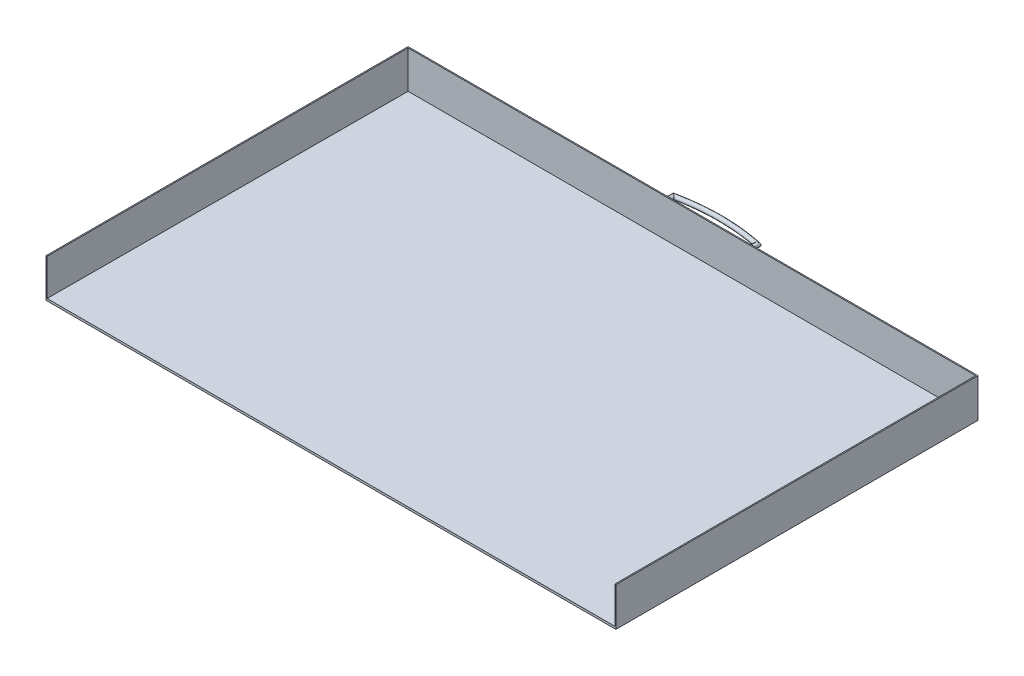
ISO-10303-21;
HEADER;
FILE_DESCRIPTION(('STEP AP214'),'2;1');
FILE_NAME('part.step','',(''),(''),'','','');
FILE_SCHEMA(('AUTOMOTIVE_DESIGN { 1 0 10303 214 1 1 1 1 }'));
ENDSEC;
DATA;
#1=APPLICATION_CONTEXT('core data for automotive mechanical design processes');
#2=APPLICATION_PROTOCOL_DEFINITION('international standard','automotive_design',2000,#1);
#3=PRODUCT_CONTEXT('',#1,'mechanical');
#4=PRODUCT('Part','Part','',(#3));
#5=PRODUCT_RELATED_PRODUCT_CATEGORY('part','',(#4));
#6=PRODUCT_DEFINITION_FORMATION('','',#4);
#7=PRODUCT_DEFINITION_CONTEXT('part definition',#1,'design');
#8=PRODUCT_DEFINITION('design','',#6,#7);
#9=PRODUCT_DEFINITION_SHAPE('','',#8);
#10=(LENGTH_UNIT() NAMED_UNIT(*) SI_UNIT(.MILLI.,.METRE.));
#11=(NAMED_UNIT(*) PLANE_ANGLE_UNIT() SI_UNIT($,.RADIAN.));
#12=(NAMED_UNIT(*) SI_UNIT($,.STERADIAN.) SOLID_ANGLE_UNIT());
#13=UNCERTAINTY_MEASURE_WITH_UNIT(LENGTH_MEASURE(1.E-05),#10,'distance_accuracy_value','');
#14=(GEOMETRIC_REPRESENTATION_CONTEXT(3) GLOBAL_UNCERTAINTY_ASSIGNED_CONTEXT((#13)) GLOBAL_UNIT_ASSIGNED_CONTEXT((#10,
#11,#12)) REPRESENTATION_CONTEXT('',''));
#15=CARTESIAN_POINT('',(0.,0.,0.));
#16=DIRECTION('',(0.,0.,1.));
#17=DIRECTION('',(1.,0.,0.));
#18=AXIS2_PLACEMENT_3D('',#15,#16,#17);
#19=CARTESIAN_POINT('',(0.,0.,0.));
#20=DIRECTION('',(0.,0.,1.));
#21=DIRECTION('',(1.,0.,0.));
#22=AXIS2_PLACEMENT_3D('',#19,#20,#21);
#23=PLANE('',#22);
#24=CARTESIAN_POINT('',(75.,0.,0.));
#25=DIRECTION('',(0.,0.,-1.));
#26=DIRECTION('',(-1.,0.,0.));
#27=AXIS2_PLACEMENT_3D('',#24,#25,#26);
#28=CIRCLE('',#27,4.00000000000001);
#29=CARTESIAN_POINT('',(71.,0.,0.));
#30=VERTEX_POINT('',#29);
#31=EDGE_CURVE('E11',#30,#30,#28,.T.);
#32=ORIENTED_EDGE('',*,*,#31,.F.);
#33=EDGE_LOOP('',(#32));
#34=FACE_BOUND('',#33,.T.);
#35=DIRECTION('',(0.,1.,0.));
#36=VECTOR('',#35,1.);
#37=CARTESIAN_POINT('',(511.5,34.75,0.));
#38=LINE('',#37,#36);
#39=CARTESIAN_POINT('',(511.5,-34.75,0.));
#40=VERTEX_POINT('',#39);
#41=CARTESIAN_POINT('',(511.5,34.75,0.));
#42=VERTEX_POINT('',#41);
#43=EDGE_CURVE('E200',#40,#42,#38,.T.);
#44=ORIENTED_EDGE('',*,*,#43,.F.);
#45=DIRECTION('',(1.,0.,0.));
#46=VECTOR('',#45,1.);
#47=CARTESIAN_POINT('',(-511.5,-34.75,0.));
#48=LINE('',#47,#46);
#49=CARTESIAN_POINT('',(-511.5,-34.75,0.));
#50=VERTEX_POINT('',#49);
#51=EDGE_CURVE('E79',#50,#40,#48,.T.);
#52=ORIENTED_EDGE('',*,*,#51,.F.);
#53=DIRECTION('',(0.,-1.,0.));
#54=VECTOR('',#53,1.);
#55=CARTESIAN_POINT('',(-511.5,34.75,0.));
#56=LINE('',#55,#54);
#57=CARTESIAN_POINT('',(-511.5,34.75,0.));
#58=VERTEX_POINT('',#57);
#59=EDGE_CURVE('E73',#58,#50,#56,.T.);
#60=ORIENTED_EDGE('',*,*,#59,.F.);
#61=DIRECTION('',(-1.,0.,0.));
#62=VECTOR('',#61,1.);
#63=CARTESIAN_POINT('',(-511.5,34.75,0.));
#64=LINE('',#63,#62);
#65=EDGE_CURVE('E255',#42,#58,#64,.T.);
#66=ORIENTED_EDGE('',*,*,#65,.F.);
#67=EDGE_LOOP('',(#44,#52,#60,#66));
#68=FACE_BOUND('',#67,.T.);
#69=CARTESIAN_POINT('',(-75.,0.,0.));
#70=DIRECTION('',(0.,0.,1.));
#71=DIRECTION('',(1.,0.,0.));
#72=AXIS2_PLACEMENT_3D('',#69,#70,#71);
#73=CIRCLE('',#72,4.00000000000001);
#74=CARTESIAN_POINT('',(-71.,0.,0.));
#75=VERTEX_POINT('',#74);
#76=EDGE_CURVE('E132',#75,#75,#73,.T.);
#77=ORIENTED_EDGE('',*,*,#76,.T.);
#78=EDGE_LOOP('',(#77));
#79=FACE_BOUND('',#78,.T.);
#80=ADVANCED_FACE('F37',(#34,#68,#79),#23,.F.);
#81=CARTESIAN_POINT('',(509.5,34.75,650.));
#82=DIRECTION('',(-1.,0.,0.));
#83=DIRECTION('',(0.,-1.,0.));
#84=AXIS2_PLACEMENT_3D('',#81,#82,#83);
#85=PLANE('',#84);
#86=DIRECTION('',(0.,1.,0.));
#87=VECTOR('',#86,1.);
#88=CARTESIAN_POINT('',(509.5,34.75,2.));
#89=LINE('',#88,#87);
#90=CARTESIAN_POINT('',(509.5,-32.75,2.));
#91=VERTEX_POINT('',#90);
#92=CARTESIAN_POINT('',(509.5,34.75,2.));
#93=VERTEX_POINT('',#92);
#94=EDGE_CURVE('E279',#91,#93,#89,.T.);
#95=ORIENTED_EDGE('',*,*,#94,.F.);
#96=DIRECTION('',(0.,-0.00296314550510196,-0.999995609874721));
#97=VECTOR('',#96,1.);
#98=CARTESIAN_POINT('',(509.5,-30.8298732830971,650.));
#99=LINE('',#98,#97);
#100=CARTESIAN_POINT('',(509.5,-30.8298732830971,650.));
#101=VERTEX_POINT('',#100);
#102=EDGE_CURVE('E135',#101,#91,#99,.T.);
#103=ORIENTED_EDGE('',*,*,#102,.F.);
#104=DIRECTION('',(0.,1.,0.));
#105=VECTOR('',#104,1.);
#106=CARTESIAN_POINT('',(509.5,34.75,650.));
#107=LINE('',#106,#105);
#108=CARTESIAN_POINT('',(509.5,34.75,650.));
#109=VERTEX_POINT('',#108);
#110=EDGE_CURVE('E265',#101,#109,#107,.T.);
#111=ORIENTED_EDGE('',*,*,#110,.T.);
#112=DIRECTION('',(0.,0.,-1.));
#113=VECTOR('',#112,1.);
#114=CARTESIAN_POINT('',(509.5,34.75,650.));
#115=LINE('',#114,#113);
#116=EDGE_CURVE('E256',#109,#93,#115,.T.);
#117=ORIENTED_EDGE('',*,*,#116,.T.);
#118=EDGE_LOOP('',(#95,#103,#111,#117));
#119=FACE_BOUND('',#118,.T.);
#120=ADVANCED_FACE('F195',(#119),#85,.T.);
#121=CARTESIAN_POINT('',(-509.5,34.75,650.));
#122=DIRECTION('',(1.,0.,0.));
#123=DIRECTION('',(0.,1.,0.));
#124=AXIS2_PLACEMENT_3D('',#121,#122,#123);
#125=PLANE('',#124);
#126=DIRECTION('',(0.,-1.,0.));
#127=VECTOR('',#126,1.);
#128=CARTESIAN_POINT('',(-509.5,34.75,650.));
#129=LINE('',#128,#127);
#130=CARTESIAN_POINT('',(-509.5,34.75,650.));
#131=VERTEX_POINT('',#130);
#132=CARTESIAN_POINT('',(-509.5,-30.8298732830987,650.));
#133=VERTEX_POINT('',#132);
#134=EDGE_CURVE('E268',#131,#133,#129,.T.);
#135=ORIENTED_EDGE('',*,*,#134,.T.);
#136=DIRECTION('',(0.,0.00296314550510196,0.999995609874721));
#137=VECTOR('',#136,1.);
#138=CARTESIAN_POINT('',(-509.5,-30.8298732830987,650.));
#139=LINE('',#138,#137);
#140=CARTESIAN_POINT('',(-509.5,-32.7500000000016,1.99999999999989));
#141=VERTEX_POINT('',#140);
#142=EDGE_CURVE('E285',#141,#133,#139,.T.);
#143=ORIENTED_EDGE('',*,*,#142,.F.);
#144=DIRECTION('',(0.,-1.,0.));
#145=VECTOR('',#144,1.);
#146=CARTESIAN_POINT('',(-509.5,34.75,2.));
#147=LINE('',#146,#145);
#148=CARTESIAN_POINT('',(-509.5,34.75,2.));
#149=VERTEX_POINT('',#148);
#150=EDGE_CURVE('E273',#149,#141,#147,.T.);
#151=ORIENTED_EDGE('',*,*,#150,.F.);
#152=DIRECTION('',(0.,0.,-1.));
#153=VECTOR('',#152,1.);
#154=CARTESIAN_POINT('',(-509.5,34.75,650.));
#155=LINE('',#154,#153);
#156=EDGE_CURVE('E241',#131,#149,#155,.T.);
#157=ORIENTED_EDGE('',*,*,#156,.F.);
#158=EDGE_LOOP('',(#135,#143,#151,#157));
#159=FACE_BOUND('',#158,.T.);
#160=ADVANCED_FACE('F218',(#159),#125,.T.);
#161=CARTESIAN_POINT('',(511.5,34.75,650.));
#162=DIRECTION('',(-1.,0.,0.));
#163=DIRECTION('',(0.,-1.,0.));
#164=AXIS2_PLACEMENT_3D('',#161,#162,#163);
#165=PLANE('',#164);
#166=ORIENTED_EDGE('',*,*,#43,.T.);
#167=DIRECTION('',(0.,0.,-1.));
#168=VECTOR('',#167,1.);
#169=CARTESIAN_POINT('',(511.5,34.75,650.));
#170=LINE('',#169,#168);
#171=CARTESIAN_POINT('',(511.5,34.75,650.));
#172=VERTEX_POINT('',#171);
#173=EDGE_CURVE('E41',#172,#42,#170,.T.);
#174=ORIENTED_EDGE('',*,*,#173,.F.);
#175=DIRECTION('',(0.,1.,0.));
#176=VECTOR('',#175,1.);
#177=CARTESIAN_POINT('',(511.5,34.75,650.));
#178=LINE('',#177,#176);
#179=CARTESIAN_POINT('',(511.5,-34.75,650.));
#180=VERTEX_POINT('',#179);
#181=EDGE_CURVE('E245',#180,#172,#178,.T.);
#182=ORIENTED_EDGE('',*,*,#181,.F.);
#183=DIRECTION('',(0.,0.,-1.));
#184=VECTOR('',#183,1.);
#185=CARTESIAN_POINT('',(511.5,-34.75,650.));
#186=LINE('',#185,#184);
#187=EDGE_CURVE('E253',#180,#40,#186,.T.);
#188=ORIENTED_EDGE('',*,*,#187,.T.);
#189=EDGE_LOOP('',(#166,#174,#182,#188));
#190=FACE_BOUND('',#189,.T.);
#191=ADVANCED_FACE('F39',(#190),#165,.F.);
#192=CARTESIAN_POINT('',(-511.5,34.75,650.));
#193=DIRECTION('',(0.,-1.,0.));
#194=DIRECTION('',(0.,0.,-1.));
#195=AXIS2_PLACEMENT_3D('',#192,#193,#194);
#196=PLANE('',#195);
#197=DIRECTION('',(-1.,0.,0.));
#198=VECTOR('',#197,1.);
#199=CARTESIAN_POINT('',(-511.5,34.75,650.));
#200=LINE('',#199,#198);
#201=CARTESIAN_POINT('',(-511.5,34.75,650.));
#202=VERTEX_POINT('',#201);
#203=EDGE_CURVE('E239',#131,#202,#200,.T.);
#204=ORIENTED_EDGE('',*,*,#203,.F.);
#205=ORIENTED_EDGE('',*,*,#156,.T.);
#206=DIRECTION('',(-1.,0.,0.));
#207=VECTOR('',#206,1.);
#208=CARTESIAN_POINT('',(-511.5,34.75,2.));
#209=LINE('',#208,#207);
#210=EDGE_CURVE('E277',#93,#149,#209,.T.);
#211=ORIENTED_EDGE('',*,*,#210,.F.);
#212=ORIENTED_EDGE('',*,*,#116,.F.);
#213=EDGE_CURVE('E87',#172,#109,#200,.T.);
#214=ORIENTED_EDGE('',*,*,#213,.F.);
#215=ORIENTED_EDGE('',*,*,#173,.T.);
#216=ORIENTED_EDGE('',*,*,#65,.T.);
#217=DIRECTION('',(0.,0.,-1.));
#218=VECTOR('',#217,1.);
#219=CARTESIAN_POINT('',(-511.5,34.75,650.));
#220=LINE('',#219,#218);
#221=EDGE_CURVE('E242',#202,#58,#220,.T.);
#222=ORIENTED_EDGE('',*,*,#221,.F.);
#223=EDGE_LOOP('',(#204,#205,#211,#212,#214,#215,#216,#222));
#224=FACE_BOUND('',#223,.T.);
#225=ADVANCED_FACE('F230',(#224),#196,.F.);
#226=CARTESIAN_POINT('',(-511.5,34.75,650.));
#227=DIRECTION('',(1.,0.,0.));
#228=DIRECTION('',(0.,1.,0.));
#229=AXIS2_PLACEMENT_3D('',#226,#227,#228);
#230=PLANE('',#229);
#231=ORIENTED_EDGE('',*,*,#59,.T.);
#232=DIRECTION('',(0.,0.,-1.));
#233=VECTOR('',#232,1.);
#234=CARTESIAN_POINT('',(-511.5,-34.75,650.));
#235=LINE('',#234,#233);
#236=CARTESIAN_POINT('',(-511.5,-34.75,650.));
#237=VERTEX_POINT('',#236);
#238=EDGE_CURVE('E261',#237,#50,#235,.T.);
#239=ORIENTED_EDGE('',*,*,#238,.F.);
#240=DIRECTION('',(0.,-1.,0.));
#241=VECTOR('',#240,1.);
#242=CARTESIAN_POINT('',(-511.5,34.75,650.));
#243=LINE('',#242,#241);
#244=EDGE_CURVE('E247',#202,#237,#243,.T.);
#245=ORIENTED_EDGE('',*,*,#244,.F.);
#246=ORIENTED_EDGE('',*,*,#221,.T.);
#247=EDGE_LOOP('',(#231,#239,#245,#246));
#248=FACE_BOUND('',#247,.T.);
#249=ADVANCED_FACE('F228',(#248),#230,.F.);
#250=CARTESIAN_POINT('',(-511.5,-34.75,650.));
#251=DIRECTION('',(0.,1.,0.));
#252=DIRECTION('',(0.,0.,1.));
#253=AXIS2_PLACEMENT_3D('',#250,#251,#252);
#254=PLANE('',#253);
#255=ORIENTED_EDGE('',*,*,#51,.T.);
#256=ORIENTED_EDGE('',*,*,#187,.F.);
#257=DIRECTION('',(1.,0.,0.));
#258=VECTOR('',#257,1.);
#259=CARTESIAN_POINT('',(-511.5,-34.75,650.));
#260=LINE('',#259,#258);
#261=EDGE_CURVE('E55',#237,#180,#260,.T.);
#262=ORIENTED_EDGE('',*,*,#261,.F.);
#263=ORIENTED_EDGE('',*,*,#238,.T.);
#264=EDGE_LOOP('',(#255,#256,#262,#263));
#265=FACE_BOUND('',#264,.T.);
#266=ADVANCED_FACE('F224',(#265),#254,.F.);
#267=CARTESIAN_POINT('',(0.,0.,650.));
#268=DIRECTION('',(0.,0.,1.));
#269=DIRECTION('',(1.,0.,0.));
#270=AXIS2_PLACEMENT_3D('',#267,#268,#269);
#271=PLANE('',#270);
#272=ORIENTED_EDGE('',*,*,#110,.F.);
#273=DIRECTION('',(1.,0.,0.));
#274=VECTOR('',#273,1.);
#275=CARTESIAN_POINT('',(-1157.50284481367,-30.8298732830997,650.));
#276=LINE('',#275,#274);
#277=EDGE_CURVE('E137',#133,#101,#276,.T.);
#278=ORIENTED_EDGE('',*,*,#277,.F.);
#279=ORIENTED_EDGE('',*,*,#134,.F.);
#280=ORIENTED_EDGE('',*,*,#203,.T.);
#281=ORIENTED_EDGE('',*,*,#244,.T.);
#282=ORIENTED_EDGE('',*,*,#261,.T.);
#283=ORIENTED_EDGE('',*,*,#181,.T.);
#284=ORIENTED_EDGE('',*,*,#213,.T.);
#285=EDGE_LOOP('',(#272,#278,#279,#280,#281,#282,#283,#284));
#286=FACE_BOUND('',#285,.T.);
#287=ADVANCED_FACE('F212',(#286),#271,.T.);
#288=CARTESIAN_POINT('',(0.,0.,2.));
#289=DIRECTION('',(0.,0.,1.));
#290=DIRECTION('',(1.,0.,0.));
#291=AXIS2_PLACEMENT_3D('',#288,#289,#290);
#292=PLANE('',#291);
#293=ORIENTED_EDGE('',*,*,#94,.T.);
#294=ORIENTED_EDGE('',*,*,#210,.T.);
#295=ORIENTED_EDGE('',*,*,#150,.T.);
#296=DIRECTION('',(1.,0.,0.));
#297=VECTOR('',#296,1.);
#298=CARTESIAN_POINT('',(-511.5,-32.75,2.));
#299=LINE('',#298,#297);
#300=EDGE_CURVE('E269',#141,#91,#299,.T.);
#301=ORIENTED_EDGE('',*,*,#300,.T.);
#302=EDGE_LOOP('',(#293,#294,#295,#301));
#303=FACE_BOUND('',#302,.T.);
#304=ADVANCED_FACE('F206',(#303),#292,.T.);
#305=CARTESIAN_POINT('',(-1157.50284481367,-30.8298732830997,650.));
#306=DIRECTION('',(0.,-0.999995609874721,0.00296314550510196));
#307=DIRECTION('',(0.,-0.00296314550510196,-0.999995609874721));
#308=AXIS2_PLACEMENT_3D('',#305,#306,#307);
#309=PLANE('',#308);
#310=ORIENTED_EDGE('',*,*,#300,.F.);
#311=ORIENTED_EDGE('',*,*,#142,.T.);
#312=ORIENTED_EDGE('',*,*,#277,.T.);
#313=ORIENTED_EDGE('',*,*,#102,.T.);
#314=EDGE_LOOP('',(#310,#311,#312,#313));
#315=FACE_BOUND('',#314,.T.);
#316=ADVANCED_FACE('F190',(#315),#309,.F.);
#317=CARTESIAN_POINT('',(75.,0.,-43.6672146269681));
#318=DIRECTION('',(0.,0.,1.));
#319=DIRECTION('',(1.,0.,0.));
#320=AXIS2_PLACEMENT_3D('',#317,#318,#319);
#321=CYLINDRICAL_SURFACE('',#320,4.00000000000001);
#322=CARTESIAN_POINT('',(75.,4.00000000000001,-40.));
#323=CARTESIAN_POINT('',(74.9966888627079,3.9999999966633,-39.9973155580531));
#324=CARTESIAN_POINT('',(74.9933776760839,3.99999588538589,-39.9946310453858));
#325=CARTESIAN_POINT('',(74.7272778646039,3.99933531565997,-39.7788907181345));
#326=CARTESIAN_POINT('',(74.4642231566213,3.97280534390981,-39.5654257995756));
#327=CARTESIAN_POINT('',(73.9444377564612,3.86732475750649,-39.1432534765215));
#328=CARTESIAN_POINT('',(73.6877126405359,3.78832952108415,-38.9345502782947));
#329=CARTESIAN_POINT('',(73.3283797947696,3.63591533614818,-38.6421877188968));
#330=CARTESIAN_POINT('',(73.2200152271546,3.58417135884664,-38.5539856433361));
#331=CARTESIAN_POINT('',(73.0067990523926,3.47012304463806,-38.3803782279642));
#332=CARTESIAN_POINT('',(72.9019442157957,3.40782875434086,-38.2949703188569));
#333=CARTESIAN_POINT('',(72.6966216750727,3.27254382698223,-38.1276698829886));
#334=CARTESIAN_POINT('',(72.5961493473681,3.19956483488431,-38.0457736530076));
#335=CARTESIAN_POINT('',(72.4004766624436,3.04273031307173,-37.8862259706623));
#336=CARTESIAN_POINT('',(72.3052762435625,2.95887491060813,-37.8085744686511));
#337=CARTESIAN_POINT('',(72.069616605836,2.7300021802298,-37.6162960541069));
#338=CARTESIAN_POINT('',(71.9336932995426,2.57704510684452,-37.5053355959629));
#339=CARTESIAN_POINT('',(71.682801392701,2.24486946164497,-37.3004378831239));
#340=CARTESIAN_POINT('',(71.5678091187351,2.06568097735484,-37.2064813972939));
#341=CARTESIAN_POINT('',(71.3820479104995,1.71543701391201,-37.0546545122835));
#342=CARTESIAN_POINT('',(71.3070892128841,1.54812793049629,-36.99336880246));
#343=CARTESIAN_POINT('',(71.2115561143577,1.28698192091118,-36.9152469859691));
#344=CARTESIAN_POINT('',(71.1825230388949,1.1982078910086,-36.8915024311984));
#345=CARTESIAN_POINT('',(71.1305095623998,1.01776418089029,-36.8489600417541));
#346=CARTESIAN_POINT('',(71.1075265999564,0.926095744535895,-36.8301601136974));
#347=CARTESIAN_POINT('',(71.0678725204684,0.739923888309358,-36.7977214274251));
#348=CARTESIAN_POINT('',(71.0512393581197,0.645406955728593,-36.7841137048445));
#349=CARTESIAN_POINT('',(71.024779730639,0.454832346353094,-36.7624661259326));
#350=CARTESIAN_POINT('',(71.014950266908,0.358775367427566,-36.7544238167528));
#351=CARTESIAN_POINT('',(71.0022733232097,0.16589671249835,-36.7440516412384));
#352=CARTESIAN_POINT('',(70.9994255932977,0.0690750639941864,-36.7417215704068));
#353=CARTESIAN_POINT('',(71.0007662743526,-0.124481251497321,-36.7428185268921));
#354=CARTESIAN_POINT('',(71.0049541914923,-0.221215924112625,-36.7462451501506));
#355=CARTESIAN_POINT('',(71.0195847157063,-0.404961636893014,-36.7582156175726));
#356=CARTESIAN_POINT('',(71.0294212586005,-0.492053979274144,-36.7662636129024));
#357=CARTESIAN_POINT('',(71.0546775126096,-0.664884975231059,-36.7869264679441));
#358=CARTESIAN_POINT('',(71.0700989929107,-0.750623190857262,-36.7995427747971));
#359=CARTESIAN_POINT('',(71.1244166347349,-1.0048921288657,-36.8439768634944));
#360=CARTESIAN_POINT('',(71.1713801538249,-1.17064790211611,-36.8823914011043));
#361=CARTESIAN_POINT('',(71.2861537356413,-1.49604296831282,-36.9762503454139));
#362=CARTESIAN_POINT('',(71.3545966081934,-1.65530372661984,-37.0322116514432));
#363=CARTESIAN_POINT('',(71.5085767077255,-1.95934769752962,-37.1580733517197));
#364=CARTESIAN_POINT('',(71.5941229790177,-2.10412318925943,-37.2279811208425));
#365=CARTESIAN_POINT('',(71.817765888362,-2.43476288051994,-37.4106763217702));
#366=CARTESIAN_POINT('',(71.9629271078723,-2.6126995238698,-37.5292102374545));
#367=CARTESIAN_POINT('',(72.2738490976203,-2.93574641327368,-37.7829519368034));
#368=CARTESIAN_POINT('',(72.4396528549337,-3.0807863206774,-37.9181945107912));
#369=CARTESIAN_POINT('',(72.8318381105139,-3.37246416066219,-38.2378902276444));
#370=CARTESIAN_POINT('',(73.0626299872764,-3.50934247550792,-38.4258874578111));
#371=CARTESIAN_POINT('',(73.4191300213498,-3.67669777911839,-38.7160374048985));
#372=CARTESIAN_POINT('',(73.539718855789,-3.72616476390508,-38.8141429643112));
#373=CARTESIAN_POINT('',(73.7835848947693,-3.81275407086355,-39.0124577374459));
#374=CARTESIAN_POINT('',(73.9068629063251,-3.84987263145376,-39.1126675823115));
#375=CARTESIAN_POINT('',(74.3465898016972,-3.95962213063176,-39.4699562046318));
#376=CARTESIAN_POINT('',(74.668811861065,-3.99918918907963,-39.7314893983711));
#377=CARTESIAN_POINT('',(74.993377737106,-3.99999589573953,-39.9946310951512));
#378=CARTESIAN_POINT('',(74.9966889242186,-4.00000000708502,-39.9973156082174));
#379=CARTESIAN_POINT('',(75.,-4.00000000000001,-40.));
#380=B_SPLINE_CURVE_WITH_KNOTS('',3,(#322,#323,#324,#325,#326,#327,#328,#329,#330,#331,#332,
#333,#334,#335,#336,#337,#338,#339,#340,#341,#342,#343,#344,#345,#346,#347,#348,#349,#350,#351,
#352,#353,#354,#355,#356,#357,#358,#359,#360,#361,#362,#363,#364,#365,#366,#367,#368,#369,#370,
#371,#372,#373,#374,#375,#376,#377,#378,#379),.UNSPECIFIED.,.F.,.F.,(4,2,2,2,2,2,2,2,2,2,2,2,2,
2,2,2,2,2,2,2,2,2,2,2,2,2,2,2,4),(0.,0.0127880805767983,1.02768668602398,2.04344957117571,
2.49008161789205,2.93629072313351,3.38201708833926,3.82773823913712,4.52325187930835,
5.2179739242544,5.79524725761085,6.08405809130132,6.37274645498883,6.66313434227929,
6.95339416506799,7.24364359645825,7.53387265629399,7.79759959349706,8.06141014681603,
8.58852234055218,9.13291101022055,9.67758831877969,10.4486191773682,11.2212834037651,
12.1986797000034,12.6876640222149,13.17679716291,14.417470634218,14.4302587147948),.UNSPECIFIED.);
#381=CARTESIAN_POINT('',(75.,4.00000000000001,-40.));
#382=VERTEX_POINT('',#381);
#383=CARTESIAN_POINT('',(75.,-4.00000000000001,-40.));
#384=VERTEX_POINT('',#383);
#385=EDGE_CURVE('E180',#382,#384,#380,.T.);
#386=ORIENTED_EDGE('',*,*,#385,.T.);
#387=CARTESIAN_POINT('',(75.,4.00000000000001,-40.));
#388=CARTESIAN_POINT('',(75.0033111368788,3.99999999663792,-40.0026844418696));
#389=CARTESIAN_POINT('',(75.0066223384172,3.99999588536075,-40.0053689361525));
#390=CARTESIAN_POINT('',(75.2727399051673,3.99933527068271,-40.2211187405722));
#391=CARTESIAN_POINT('',(75.5359087582865,3.97280169267875,-40.4344778786384));
#392=CARTESIAN_POINT('',(76.0560832910714,3.86719584577603,-40.8561994045589));
#393=CARTESIAN_POINT('',(76.3130836582061,3.78807986238687,-41.0645574853176));
#394=CARTESIAN_POINT('',(76.6724205184446,3.63553704507525,-41.3558828681245));
#395=CARTESIAN_POINT('',(76.780497759357,3.58390638115961,-41.4435043884617));
#396=CARTESIAN_POINT('',(76.9931727831646,3.47012868034312,-41.6159265198856));
#397=CARTESIAN_POINT('',(77.0977737616952,3.40799164069047,-41.7007297217774));
#398=CARTESIAN_POINT('',(77.3026199998312,3.27306626834865,-41.8668048071991));
#399=CARTESIAN_POINT('',(77.4028698558388,3.20028954870614,-41.9480804171768));
#400=CARTESIAN_POINT('',(77.5981282828866,3.04390916821645,-42.1063823654178));
#401=CARTESIAN_POINT('',(77.6931368981693,2.96030559878139,-42.1834087395499));
#402=CARTESIAN_POINT('',(77.9288064339011,2.73170382836833,-42.3744731989637));
#403=CARTESIAN_POINT('',(78.0649052037834,2.57872026271684,-42.4848126093538));
#404=CARTESIAN_POINT('',(78.3161005786803,2.24650152703096,-42.6884643380693));
#405=CARTESIAN_POINT('',(78.4312205621487,2.0672959850698,-42.7817956100163));
#406=CARTESIAN_POINT('',(78.6173865191704,1.71668001637231,-42.9327260158976));
#407=CARTESIAN_POINT('',(78.6925820880082,1.54896397467105,-42.9936893525496));
#408=CARTESIAN_POINT('',(78.7883715806911,1.28721079733842,-43.0713488111509));
#409=CARTESIAN_POINT('',(78.8174737222109,1.19823449286446,-43.0949428036656));
#410=CARTESIAN_POINT('',(78.869593581245,1.01739099092396,-43.13719796109));
#411=CARTESIAN_POINT('',(78.8926138655129,0.925525031368722,-43.155861206945));
#412=CARTESIAN_POINT('',(78.9323103644099,0.738975232161001,-43.1880443682555));
#413=CARTESIAN_POINT('',(78.9489491830883,0.64427818537517,-43.2015339656752));
#414=CARTESIAN_POINT('',(78.975393520691,0.453352315564882,-43.2229731962022));
#415=CARTESIAN_POINT('',(78.9852020363257,0.357124183263621,-43.2309252588339));
#416=CARTESIAN_POINT('',(78.9978125919037,0.163910793456873,-43.241149020675));
#417=CARTESIAN_POINT('',(79.0006148309737,0.0669255575477714,-43.2434208813226));
#418=CARTESIAN_POINT('',(78.9991599708421,-0.126951554008707,-43.2422413818603));
#419=CARTESIAN_POINT('',(78.9949033572562,-0.223843435619589,-43.2387904154538));
#420=CARTESIAN_POINT('',(78.9801079581892,-0.408034830584741,-43.2267953344017));
#421=CARTESIAN_POINT('',(78.9701673782298,-0.495414685528408,-43.2187362032063));
#422=CARTESIAN_POINT('',(78.9446652168901,-0.668812525853075,-43.198060823713));
#423=CARTESIAN_POINT('',(78.9291018518682,-0.754830070038202,-43.1854431293625));
#424=CARTESIAN_POINT('',(78.8743029260149,-1.0099208615062,-43.1410159703206));
#425=CARTESIAN_POINT('',(78.8269441685875,-1.17620411543838,-43.1026207828392));
#426=CARTESIAN_POINT('',(78.7112412942125,-1.50256329779682,-43.0088169391246));
#427=CARTESIAN_POINT('',(78.6422648419432,-1.66226153417464,-42.9528956294317));
#428=CARTESIAN_POINT('',(78.4870996464254,-1.96708579394567,-42.8270984837032));
#429=CARTESIAN_POINT('',(78.4009020085809,-2.11220422854299,-42.7572154365488));
#430=CARTESIAN_POINT('',(78.176113211526,-2.4427348063467,-42.5749723224928));
#431=CARTESIAN_POINT('',(78.0305268413805,-2.62028885050169,-42.4569410260474));
#432=CARTESIAN_POINT('',(77.718799682945,-2.94255622761818,-42.2042143398911));
#433=CARTESIAN_POINT('',(77.5526154176092,-3.08719820309412,-42.0694837020141));
#434=CARTESIAN_POINT('',(77.1561872002923,-3.38048485756912,-41.7480872787615));
#435=CARTESIAN_POINT('',(76.9211809935274,-3.51853087569364,-41.5575605853668));
#436=CARTESIAN_POINT('',(76.5582886729965,-3.68639776799215,-41.2633526920074));
#437=CARTESIAN_POINT('',(76.4355547006616,-3.73582888067613,-41.1638485052667));
#438=CARTESIAN_POINT('',(76.1874105739845,-3.8219520882197,-40.9626704558463));
#439=CARTESIAN_POINT('',(76.0619997461836,-3.85864093623527,-40.8609960471696));
#440=CARTESIAN_POINT('',(75.6306883583569,-3.96238007690995,-40.5113186332814));
#441=CARTESIAN_POINT('',(75.3198194157192,-3.99921750887913,-40.2592875669366));
#442=CARTESIAN_POINT('',(75.0066222832443,-3.9999958950169,-40.0053688914226));
#443=CARTESIAN_POINT('',(75.0033110812343,-4.00000000636645,-40.0026843967571));
#444=CARTESIAN_POINT('',(75.,-4.00000000000001,-40.));
#445=B_SPLINE_CURVE_WITH_KNOTS('',3,(#387,#388,#389,#390,#391,#392,#393,#394,#395,#396,#397,
#398,#399,#400,#401,#402,#403,#404,#405,#406,#407,#408,#409,#410,#411,#412,#413,#414,#415,#416,
#417,#418,#419,#420,#421,#422,#423,#424,#425,#426,#427,#428,#429,#430,#431,#432,#433,#434,#435,
#436,#437,#438,#439,#440,#441,#442,#443,#444),.UNSPECIFIED.,.F.,.F.,(4,2,2,2,2,2,2,2,2,2,2,2,2,
2,2,2,2,2,2,2,2,2,2,2,2,2,2,2,4),(0.,0.0127880805766437,1.02774587892334,2.04354852174024,
2.48840707100077,2.93284467701938,3.37680075864673,3.820753092155,4.51572958048082,
5.20992679687278,5.78821567070043,6.07753685822756,6.36673574647265,6.65760437361277,
6.94834530522559,7.23907797353751,7.52979064164692,7.79440799822948,8.05910936967507,
8.58799993125271,9.13408929619901,9.68046144423502,10.4507358258855,11.2226646748591,
12.2145035483472,12.7107284491901,13.2070797000073,14.4038385985958,14.4166266791724),.UNSPECIFIED.);
#446=EDGE_CURVE('E176',#382,#384,#445,.T.);
#447=ORIENTED_EDGE('',*,*,#446,.F.);
#448=EDGE_LOOP('',(#386,#447));
#449=FACE_BOUND('',#448,.T.);
#450=ORIENTED_EDGE('',*,*,#31,.T.);
#451=EDGE_LOOP('',(#450));
#452=FACE_BOUND('',#451,.T.);
#453=ADVANCED_FACE('F165',(#449,#452),#321,.T.);
#454=CARTESIAN_POINT('',(-77.7607714387563,0.,-35.328104861708));
#455=CARTESIAN_POINT('',(-76.5647893689857,0.,-35.5808904798739));
#456=CARTESIAN_POINT('',(-75.3622122297455,0.,-35.835070899328));
#457=CARTESIAN_POINT('',(-71.1100902384665,0.,-36.7338064836702));
#458=CARTESIAN_POINT('',(-68.0729630334648,0.,-37.3343176882566));
#459=CARTESIAN_POINT('',(-61.9500641581608,0.,-38.4627965393745));
#460=CARTESIAN_POINT('',(-58.8812762425967,0.,-38.9871765830276));
#461=CARTESIAN_POINT('',(-49.6559982371793,0.,-40.4402096924662));
#462=CARTESIAN_POINT('',(-43.4805881471407,0.,-41.2487285040681));
#463=CARTESIAN_POINT('',(-24.9038102726937,0.,-43.1904878223486));
#464=CARTESIAN_POINT('',(-12.451985824659,0.,-43.8394904495203));
#465=CARTESIAN_POINT('',(12.451985824659,0.,-43.8394904495203));
#466=CARTESIAN_POINT('',(24.9038102727975,0.,-43.1904878222504));
#467=CARTESIAN_POINT('',(43.4805881470887,0.,-41.2487285041173));
#468=CARTESIAN_POINT('',(49.6559982370839,0.,-40.4402096922997));
#469=CARTESIAN_POINT('',(58.8812762426443,0.,-38.987176583111));
#470=CARTESIAN_POINT('',(61.9500641581688,0.,-38.4627965393731));
#471=CARTESIAN_POINT('',(68.0729630334567,0.,-37.3343176882581));
#472=CARTESIAN_POINT('',(71.1100902384891,0.,-36.7338064836436));
#473=CARTESIAN_POINT('',(75.3622122297367,0.,-35.8350708993384));
#474=CARTESIAN_POINT('',(76.564789368969,0.,-35.5808904798721));
#475=CARTESIAN_POINT('',(77.7607714387563,0.,-35.328104861708));
#476=CARTESIAN_POINT('',(-77.7607714387563,8.00000000000001,-35.328104861708));
#477=CARTESIAN_POINT('',(-76.5647893689857,8.00000000000001,-35.5808904798739));
#478=CARTESIAN_POINT('',(-75.3622122297455,8.00000000000001,-35.835070899328));
#479=CARTESIAN_POINT('',(-71.1100902384665,8.00000000000001,-36.7338064836702));
#480=CARTESIAN_POINT('',(-68.0729630334648,8.00000000000001,-37.3343176882566));
#481=CARTESIAN_POINT('',(-61.9500641581608,8.00000000000001,-38.4627965393745));
#482=CARTESIAN_POINT('',(-58.8812762425967,8.00000000000001,-38.9871765830276));
#483=CARTESIAN_POINT('',(-49.6559982371793,8.00000000000001,-40.4402096924662));
#484=CARTESIAN_POINT('',(-43.4805881471407,8.00000000000001,-41.2487285040681));
#485=CARTESIAN_POINT('',(-24.9038102726937,8.00000000000001,-43.1904878223486));
#486=CARTESIAN_POINT('',(-12.451985824659,8.00000000000001,-43.8394904495203));
#487=CARTESIAN_POINT('',(12.451985824659,8.00000000000001,-43.8394904495203));
#488=CARTESIAN_POINT('',(24.9038102727975,8.00000000000001,-43.1904878222504));
#489=CARTESIAN_POINT('',(43.4805881470887,8.00000000000001,-41.2487285041173));
#490=CARTESIAN_POINT('',(49.6559982370839,8.00000000000001,-40.4402096922997));
#491=CARTESIAN_POINT('',(58.8812762426443,8.00000000000001,-38.987176583111));
#492=CARTESIAN_POINT('',(61.9500641581688,8.00000000000001,-38.4627965393731));
#493=CARTESIAN_POINT('',(68.0729630334567,8.00000000000001,-37.3343176882581));
#494=CARTESIAN_POINT('',(71.1100902384891,8.00000000000001,-36.7338064836436));
#495=CARTESIAN_POINT('',(75.3622122297367,8.00000000000001,-35.8350708993384));
#496=CARTESIAN_POINT('',(76.564789368969,8.00000000000001,-35.5808904798721));
#497=CARTESIAN_POINT('',(77.7607714387563,8.00000000000001,-35.328104861708));
#498=CARTESIAN_POINT('',(-79.4151209800314,8.00000000000001,-43.1551814293215));
#499=CARTESIAN_POINT('',(-78.2191389102608,8.00000000000001,-43.4079670474873));
#500=CARTESIAN_POINT('',(-77.0297522574364,8.00000000000001,-43.6593595133185));
#501=CARTESIAN_POINT('',(-72.7304735733855,8.00000000000001,-44.568062180626));
#502=CARTESIAN_POINT('',(-69.5912613431137,8.00000000000001,-45.1892264160867));
#503=CARTESIAN_POINT('',(-63.331797426445,8.00000000000001,-46.3428748419487));
#504=CARTESIAN_POINT('',(-60.1945633129093,8.00000000000001,-46.8789506499482));
#505=CARTESIAN_POINT('',(-50.7635248501931,8.00000000000001,-48.3643921872972));
#506=CARTESIAN_POINT('',(-44.4503785094992,8.00000000000001,-49.1909441899094));
#507=CARTESIAN_POINT('',(-25.4592644699924,8.00000000000001,-51.1760124778129));
#508=CARTESIAN_POINT('',(-12.7297147229892,8.00000000000001,-51.8394904495203));
#509=CARTESIAN_POINT('',(12.7297147229892,8.00000000000001,-51.8394904495203));
#510=CARTESIAN_POINT('',(25.4592644701422,8.00000000000001,-51.1760124778018));
#511=CARTESIAN_POINT('',(44.4503785094241,8.00000000000001,-49.190944189915));
#512=CARTESIAN_POINT('',(50.7635248500966,8.00000000000001,-48.3643921871744));
#513=CARTESIAN_POINT('',(60.1945633129575,8.00000000000001,-46.8789506500096));
#514=CARTESIAN_POINT('',(63.3317974264531,8.00000000000001,-46.342874841969));
#515=CARTESIAN_POINT('',(69.5912613431054,8.00000000000001,-45.1892264160664));
#516=CARTESIAN_POINT('',(72.7304735733645,8.00000000000001,-44.5680621805993));
#517=CARTESIAN_POINT('',(77.0297522574444,8.00000000000001,-43.6593595133289));
#518=CARTESIAN_POINT('',(78.2191389102441,8.00000000000001,-43.4079670474855));
#519=CARTESIAN_POINT('',(79.4151209800314,8.00000000000001,-43.1551814293214));
#520=CARTESIAN_POINT('',(-79.4151209800314,0.,-43.1551814293215));
#521=CARTESIAN_POINT('',(-78.2191389102608,0.,-43.4079670474873));
#522=CARTESIAN_POINT('',(-77.0297522574364,0.,-43.6593595133185));
#523=CARTESIAN_POINT('',(-72.7304735733855,0.,-44.568062180626));
#524=CARTESIAN_POINT('',(-69.5912613431137,0.,-45.1892264160867));
#525=CARTESIAN_POINT('',(-63.331797426445,0.,-46.3428748419487));
#526=CARTESIAN_POINT('',(-60.1945633129093,0.,-46.8789506499482));
#527=CARTESIAN_POINT('',(-50.7635248501931,0.,-48.3643921872972));
#528=CARTESIAN_POINT('',(-44.4503785094992,0.,-49.1909441899094));
#529=CARTESIAN_POINT('',(-25.4592644699924,0.,-51.1760124778129));
#530=CARTESIAN_POINT('',(-12.7297147229892,0.,-51.8394904495203));
#531=CARTESIAN_POINT('',(12.7297147229892,0.,-51.8394904495203));
#532=CARTESIAN_POINT('',(25.4592644701422,0.,-51.1760124778018));
#533=CARTESIAN_POINT('',(44.4503785094241,0.,-49.190944189915));
#534=CARTESIAN_POINT('',(50.7635248500966,0.,-48.3643921871744));
#535=CARTESIAN_POINT('',(60.1945633129574,0.,-46.8789506500096));
#536=CARTESIAN_POINT('',(63.3317974264531,0.,-46.342874841969));
#537=CARTESIAN_POINT('',(69.5912613431054,0.,-45.1892264160664));
#538=CARTESIAN_POINT('',(72.7304735733645,0.,-44.5680621805993));
#539=CARTESIAN_POINT('',(77.0297522574444,0.,-43.6593595133289));
#540=CARTESIAN_POINT('',(78.2191389102441,0.,-43.4079670474855));
#541=CARTESIAN_POINT('',(79.4151209800314,0.,-43.1551814293214));
#542=CARTESIAN_POINT('',(-79.4151209800314,-8.00000000000001,-43.1551814293215));
#543=CARTESIAN_POINT('',(-78.2191389102608,-8.00000000000001,-43.4079670474873));
#544=CARTESIAN_POINT('',(-77.0297522574364,-8.00000000000001,-43.6593595133185));
#545=CARTESIAN_POINT('',(-72.7304735733855,-8.00000000000001,-44.568062180626));
#546=CARTESIAN_POINT('',(-69.5912613431137,-8.00000000000001,-45.1892264160867));
#547=CARTESIAN_POINT('',(-63.331797426445,-8.00000000000001,-46.3428748419487));
#548=CARTESIAN_POINT('',(-60.1945633129093,-8.00000000000001,-46.8789506499482));
#549=CARTESIAN_POINT('',(-50.7635248501931,-8.00000000000001,-48.3643921872972));
#550=CARTESIAN_POINT('',(-44.4503785094992,-8.00000000000001,-49.1909441899094));
#551=CARTESIAN_POINT('',(-25.4592644699924,-8.00000000000001,-51.1760124778129));
#552=CARTESIAN_POINT('',(-12.7297147229892,-8.00000000000001,-51.8394904495203));
#553=CARTESIAN_POINT('',(12.7297147229892,-8.00000000000001,-51.8394904495203));
#554=CARTESIAN_POINT('',(25.4592644701422,-8.00000000000001,-51.1760124778018));
#555=CARTESIAN_POINT('',(44.4503785094241,-8.00000000000001,-49.190944189915));
#556=CARTESIAN_POINT('',(50.7635248500966,-8.00000000000001,-48.3643921871744));
#557=CARTESIAN_POINT('',(60.1945633129575,-8.00000000000001,-46.8789506500096));
#558=CARTESIAN_POINT('',(63.3317974264531,-8.00000000000001,-46.342874841969));
#559=CARTESIAN_POINT('',(69.5912613431054,-8.00000000000001,-45.1892264160664));
#560=CARTESIAN_POINT('',(72.7304735733645,-8.00000000000001,-44.5680621805993));
#561=CARTESIAN_POINT('',(77.0297522574444,-8.00000000000001,-43.6593595133289));
#562=CARTESIAN_POINT('',(78.2191389102441,-8.00000000000001,-43.4079670474855));
#563=CARTESIAN_POINT('',(79.4151209800314,-8.00000000000001,-43.1551814293214));
#564=CARTESIAN_POINT('',(-77.7607714387563,-8.00000000000001,-35.328104861708));
#565=CARTESIAN_POINT('',(-76.5647893689857,-8.00000000000001,-35.5808904798739));
#566=CARTESIAN_POINT('',(-75.3622122297455,-8.00000000000001,-35.835070899328));
#567=CARTESIAN_POINT('',(-71.1100902384665,-8.00000000000001,-36.7338064836702));
#568=CARTESIAN_POINT('',(-68.0729630334648,-8.00000000000001,-37.3343176882566));
#569=CARTESIAN_POINT('',(-61.9500641581608,-8.00000000000001,-38.4627965393745));
#570=CARTESIAN_POINT('',(-58.8812762425967,-8.00000000000001,-38.9871765830276));
#571=CARTESIAN_POINT('',(-49.6559982371793,-8.00000000000001,-40.4402096924662));
#572=CARTESIAN_POINT('',(-43.4805881471407,-8.00000000000001,-41.2487285040681));
#573=CARTESIAN_POINT('',(-24.9038102726937,-8.00000000000001,-43.1904878223486));
#574=CARTESIAN_POINT('',(-12.451985824659,-8.00000000000001,-43.8394904495203));
#575=CARTESIAN_POINT('',(12.451985824659,-8.00000000000001,-43.8394904495203));
#576=CARTESIAN_POINT('',(24.9038102727975,-8.00000000000001,-43.1904878222504));
#577=CARTESIAN_POINT('',(43.4805881470887,-8.00000000000001,-41.2487285041173));
#578=CARTESIAN_POINT('',(49.6559982370839,-8.00000000000001,-40.4402096922997));
#579=CARTESIAN_POINT('',(58.8812762426443,-8.00000000000001,-38.987176583111));
#580=CARTESIAN_POINT('',(61.9500641581688,-8.00000000000001,-38.4627965393731));
#581=CARTESIAN_POINT('',(68.0729630334567,-8.00000000000001,-37.3343176882581));
#582=CARTESIAN_POINT('',(71.1100902384891,-8.00000000000001,-36.7338064836436));
#583=CARTESIAN_POINT('',(75.3622122297367,-8.00000000000001,-35.8350708993384));
#584=CARTESIAN_POINT('',(76.564789368969,-8.00000000000001,-35.5808904798721));
#585=CARTESIAN_POINT('',(77.7607714387563,-8.00000000000001,-35.328104861708));
#586=CARTESIAN_POINT('',(-77.7607714387563,0.,-35.328104861708));
#587=CARTESIAN_POINT('',(-76.5647893689857,0.,-35.5808904798739));
#588=CARTESIAN_POINT('',(-75.3622122297455,0.,-35.835070899328));
#589=CARTESIAN_POINT('',(-71.1100902384665,0.,-36.7338064836702));
#590=CARTESIAN_POINT('',(-68.0729630334648,0.,-37.3343176882566));
#591=CARTESIAN_POINT('',(-61.9500641581608,0.,-38.4627965393745));
#592=CARTESIAN_POINT('',(-58.8812762425967,0.,-38.9871765830276));
#593=CARTESIAN_POINT('',(-49.6559982371793,0.,-40.4402096924662));
#594=CARTESIAN_POINT('',(-43.4805881471407,0.,-41.2487285040681));
#595=CARTESIAN_POINT('',(-24.9038102726937,0.,-43.1904878223486));
#596=CARTESIAN_POINT('',(-12.451985824659,0.,-43.8394904495203));
#597=CARTESIAN_POINT('',(12.451985824659,0.,-43.8394904495203));
#598=CARTESIAN_POINT('',(24.9038102727975,0.,-43.1904878222504));
#599=CARTESIAN_POINT('',(43.4805881470887,0.,-41.2487285041173));
#600=CARTESIAN_POINT('',(49.6559982370839,0.,-40.4402096922997));
#601=CARTESIAN_POINT('',(58.8812762426443,0.,-38.987176583111));
#602=CARTESIAN_POINT('',(61.9500641581688,0.,-38.4627965393731));
#603=CARTESIAN_POINT('',(68.0729630334567,0.,-37.3343176882581));
#604=CARTESIAN_POINT('',(71.1100902384891,0.,-36.7338064836436));
#605=CARTESIAN_POINT('',(75.3622122297367,0.,-35.8350708993384));
#606=CARTESIAN_POINT('',(76.564789368969,0.,-35.5808904798721));
#607=CARTESIAN_POINT('',(77.7607714387563,0.,-35.328104861708));
#608=(BOUNDED_SURFACE() B_SPLINE_SURFACE(3,3,((#454,#455,#456,#457,#458,#459,#460,#461,#462,
#463,#464,#465,#466,#467,#468,#469,#470,#471,#472,#473,#474,#475),(#476,#477,#478,#479,#480,
#481,#482,#483,#484,#485,#486,#487,#488,#489,#490,#491,#492,#493,#494,#495,#496,#497),(#498,
#499,#500,#501,#502,#503,#504,#505,#506,#507,#508,#509,#510,#511,#512,#513,#514,#515,#516,#517,
#518,#519),(#520,#521,#522,#523,#524,#525,#526,#527,#528,#529,#530,#531,#532,#533,#534,#535,
#536,#537,#538,#539,#540,#541),(#542,#543,#544,#545,#546,#547,#548,#549,#550,#551,#552,#553,
#554,#555,#556,#557,#558,#559,#560,#561,#562,#563),(#564,#565,#566,#567,#568,#569,#570,#571,
#572,#573,#574,#575,#576,#577,#578,#579,#580,#581,#582,#583,#584,#585),(#586,#587,#588,#589,
#590,#591,#592,#593,#594,#595,#596,#597,#598,#599,#600,#601,#602,#603,#604,#605,#606,#607)),
.UNSPECIFIED.,.T.,.F.,.F.) B_SPLINE_SURFACE_WITH_KNOTS((4,3,4),(4,2,2,2,2,2,2,2,2,2,4),(0.,0.5,
1.),(-0.0242713417076241,0.,0.0625,0.125,0.25,0.5,0.75,0.875,0.9375,1.,1.02427134170763),
.UNSPECIFIED.) GEOMETRIC_REPRESENTATION_ITEM() RATIONAL_B_SPLINE_SURFACE(((1.,1.,1.,1.,1.,1.,1.,
1.,1.,1.,1.,1.,1.,1.,1.,1.,1.,1.,1.,1.,1.,1.),(0.333333333333333,0.333333333333333,
0.333333333333333,0.333333333333333,0.333333333333333,0.333333333333333,0.333333333333333,
0.333333333333333,0.333333333333333,0.333333333333333,0.333333333333333,0.333333333333333,
0.333333333333333,0.333333333333333,0.333333333333333,0.333333333333333,0.333333333333333,
0.333333333333333,0.333333333333333,0.333333333333333,0.333333333333333,0.333333333333333),
(0.333333333333333,0.333333333333333,0.333333333333333,0.333333333333333,0.333333333333333,
0.333333333333333,0.333333333333333,0.333333333333333,0.333333333333333,0.333333333333333,
0.333333333333333,0.333333333333333,0.333333333333333,0.333333333333333,0.333333333333333,
0.333333333333333,0.333333333333333,0.333333333333333,0.333333333333333,0.333333333333333,
0.333333333333333,0.333333333333333),(1.,1.,1.,1.,1.,1.,1.,1.,1.,1.,1.,1.,1.,1.,1.,1.,1.,1.,1.,
1.,1.,1.),(0.333333333333333,0.333333333333333,0.333333333333333,0.333333333333333,
0.333333333333333,0.333333333333333,0.333333333333333,0.333333333333333,0.333333333333333,
0.333333333333333,0.333333333333333,0.333333333333333,0.333333333333333,0.333333333333333,
0.333333333333333,0.333333333333333,0.333333333333333,0.333333333333333,0.333333333333333,
0.333333333333333,0.333333333333333,0.333333333333333),(0.333333333333333,0.333333333333333,
0.333333333333333,0.333333333333333,0.333333333333333,0.333333333333333,0.333333333333333,
0.333333333333333,0.333333333333333,0.333333333333333,0.333333333333333,0.333333333333333,
0.333333333333333,0.333333333333333,0.333333333333333,0.333333333333333,0.333333333333333,
0.333333333333333,0.333333333333333,0.333333333333333,0.333333333333333,0.333333333333333),(1.,
1.,1.,1.,1.,1.,1.,1.,1.,1.,1.,1.,1.,1.,1.,1.,1.,1.,1.,1.,1.,1.))) REPRESENTATION_ITEM('') SURFACE());
#609=CARTESIAN_POINT('',(-75.,4.00000000000001,-40.));
#610=CARTESIAN_POINT('',(-74.9966888627078,3.9999999966633,-39.9973155580532));
#611=CARTESIAN_POINT('',(-74.9933776760838,3.99999588538589,-39.994631045386));
#612=CARTESIAN_POINT('',(-74.7272778645982,3.99933531566008,-39.7788907181414));
#613=CARTESIAN_POINT('',(-74.4642231566183,3.97280534390965,-39.5654257995792));
#614=CARTESIAN_POINT('',(-73.9444377564595,3.86732475750571,-39.1432534765236));
#615=CARTESIAN_POINT('',(-73.6877126405326,3.78832952108299,-38.9345502782987));
#616=CARTESIAN_POINT('',(-73.3283797947656,3.6359153361464,-38.6421877189019));
#617=CARTESIAN_POINT('',(-73.2200152271505,3.58417135884466,-38.5539856433413));
#618=CARTESIAN_POINT('',(-73.0067990523884,3.47012304463565,-38.3803782279697));
#619=CARTESIAN_POINT('',(-72.9019442157914,3.40782875433824,-38.2949703188626));
#620=CARTESIAN_POINT('',(-72.6966216750683,3.27254382697921,-38.1276698829947));
#621=CARTESIAN_POINT('',(-72.5961493473637,3.19956483488108,-38.0457736530138));
#622=CARTESIAN_POINT('',(-72.4004766624393,3.04273031306808,-37.8862259706689));
#623=CARTESIAN_POINT('',(-72.3052762435582,2.95887491060429,-37.8085744686577));
#624=CARTESIAN_POINT('',(-72.0696166058319,2.73000218022552,-37.6162960541139));
#625=CARTESIAN_POINT('',(-71.9336932995388,2.57704510684002,-37.5053355959702));
#626=CARTESIAN_POINT('',(-71.6828013926977,2.24486946164011,-37.3004378831316));
#627=CARTESIAN_POINT('',(-71.5678091187321,2.06568097734984,-37.2064813973018));
#628=CARTESIAN_POINT('',(-71.382047910497,1.71543701390684,-37.0546545122917));
#629=CARTESIAN_POINT('',(-71.3070892128818,1.5481279304911,-36.9933688024684));
#630=CARTESIAN_POINT('',(-71.2115561143559,1.28698192090598,-36.9152469859778));
#631=CARTESIAN_POINT('',(-71.1825230388933,1.19820789100341,-36.8915024312072));
#632=CARTESIAN_POINT('',(-71.1305095623984,1.01776418088514,-36.848960041763));
#633=CARTESIAN_POINT('',(-71.1075265999551,0.92609574453079,-36.8301601137064));
#634=CARTESIAN_POINT('',(-71.0678725204674,0.73992388830432,-36.7977214274342));
#635=CARTESIAN_POINT('',(-71.0512393581188,0.64540695572358,-36.7841137048538));
#636=CARTESIAN_POINT('',(-71.0247797306385,0.454832346348162,-36.7624661259421));
#637=CARTESIAN_POINT('',(-71.0149502669076,0.358775367422689,-36.7544238167623));
#638=CARTESIAN_POINT('',(-71.0022733232095,0.165896712493591,-36.7440516412481));
#639=CARTESIAN_POINT('',(-70.9994255932976,0.0690750639894885,-36.7417215704166));
#640=CARTESIAN_POINT('',(-71.0007662743527,-0.124481251501878,-36.742818526902));
#641=CARTESIAN_POINT('',(-71.0049541914926,-0.221215924117104,-36.7462451501607));
#642=CARTESIAN_POINT('',(-71.0195847157068,-0.404961636897336,-36.7582156175828));
#643=CARTESIAN_POINT('',(-71.029421258601,-0.492053979278389,-36.7662636129127));
#644=CARTESIAN_POINT('',(-71.0546775126103,-0.664884975235136,-36.7869264679546));
#645=CARTESIAN_POINT('',(-71.0700989929115,-0.750623190861249,-36.7995427748077));
#646=CARTESIAN_POINT('',(-71.1244166347359,-1.00489212886941,-36.8439768635052));
#647=CARTESIAN_POINT('',(-71.171380153826,-1.17064790211961,-36.8823914011152));
#648=CARTESIAN_POINT('',(-71.2861537356426,-1.49604296831603,-36.9762503454251));
#649=CARTESIAN_POINT('',(-71.3545966081948,-1.65530372662296,-37.0322116514546));
#650=CARTESIAN_POINT('',(-71.5085767077271,-1.95934769753254,-37.1580733517313));
#651=CARTESIAN_POINT('',(-71.5941229790195,-2.10412318926222,-37.2279811208543));
#652=CARTESIAN_POINT('',(-71.8177658883643,-2.43476288052279,-37.4106763217823));
#653=CARTESIAN_POINT('',(-71.9629271078749,-2.6126995238728,-37.529210237467));
#654=CARTESIAN_POINT('',(-72.2738490976237,-2.93574641327688,-37.7829519368164));
#655=CARTESIAN_POINT('',(-72.4396528549375,-3.08078632068066,-37.9181945108044));
#656=CARTESIAN_POINT('',(-72.8318381105185,-3.37246416066525,-38.2378902276577));
#657=CARTESIAN_POINT('',(-73.0626299872814,-3.50934247551076,-38.4258874578243));
#658=CARTESIAN_POINT('',(-73.4191300213556,-3.6766977791209,-38.7160374049111));
#659=CARTESIAN_POINT('',(-73.5397188557951,-3.72616476390748,-38.8141429643235));
#660=CARTESIAN_POINT('',(-73.7835848947759,-3.81275407086568,-39.0124577374581));
#661=CARTESIAN_POINT('',(-73.9068629063316,-3.84987263145573,-39.1126675823237));
#662=CARTESIAN_POINT('',(-74.346589801703,-3.95962213063225,-39.4699562046385));
#663=CARTESIAN_POINT('',(-74.6688118610739,-3.99918918907952,-39.731489398367));
#664=CARTESIAN_POINT('',(-74.993377737106,-3.99999589573953,-39.9946310951511));
#665=CARTESIAN_POINT('',(-74.9966889242186,-4.00000000708502,-39.9973156082173));
#666=CARTESIAN_POINT('',(-75.,-4.00000000000001,-40.));
#667=B_SPLINE_CURVE_WITH_KNOTS('',3,(#609,#610,#611,#612,#613,#614,#615,#616,#617,#618,#619,
#620,#621,#622,#623,#624,#625,#626,#627,#628,#629,#630,#631,#632,#633,#634,#635,#636,#637,#638,
#639,#640,#641,#642,#643,#644,#645,#646,#647,#648,#649,#650,#651,#652,#653,#654,#655,#656,#657,
#658,#659,#660,#661,#662,#663,#664,#665,#666),.UNSPECIFIED.,.F.,.F.,(4,2,2,2,2,2,2,2,2,2,2,2,2,
2,2,2,2,2,2,2,2,2,2,2,2,2,2,2,4),(0.,0.0127880805767441,1.02768668602401,2.04344957117593,
2.49008161789238,2.9362907231339,3.38201708833971,3.82773823913764,4.52325187930858,
5.21797392425436,5.79524725761039,6.08405809130065,6.37274645498794,6.66313434227818,
6.95339416506666,7.24364359645672,7.53387265629225,7.79759959349513,8.06141014681391,
8.58852234054969,9.13291101021809,9.67758831877727,10.448619177367,11.2212834037652,
12.1986797000039,12.6876640222155,13.1767971629107,14.4174706342057,14.4302587147825),.UNSPECIFIED.);
#668=CARTESIAN_POINT('',(-75.,4.00000000000001,-40.));
#669=VERTEX_POINT('',#668);
#670=CARTESIAN_POINT('',(-75.,-4.00000000000001,-40.));
#671=VERTEX_POINT('',#670);
#672=EDGE_CURVE('E126',#669,#671,#667,.T.);
#673=CARTESIAN_POINT('',(-75.,4.00000000000001,-40.));
#674=CARTESIAN_POINT('',(-75.0033111368789,3.99999999663792,-40.0026844418696));
#675=CARTESIAN_POINT('',(-75.0066223384173,3.99999588536075,-40.0053689361523));
#676=CARTESIAN_POINT('',(-75.2727399051732,3.99933527068273,-40.2211187405649));
#677=CARTESIAN_POINT('',(-75.5359087582892,3.97280169267859,-40.4344778786351));
#678=CARTESIAN_POINT('',(-76.056083291072,3.86719584577551,-40.8561994045582));
#679=CARTESIAN_POINT('',(-76.3130836582077,3.78807986238618,-41.0645574853156));
#680=CARTESIAN_POINT('',(-76.6724205184465,3.63553704507436,-41.3558828681225));
#681=CARTESIAN_POINT('',(-76.780497759359,3.58390638115861,-41.4435043884601));
#682=CARTESIAN_POINT('',(-76.9931727831668,3.47012868034186,-41.6159265198846));
#683=CARTESIAN_POINT('',(-77.0977737616974,3.40799164068906,-41.7007297217767));
#684=CARTESIAN_POINT('',(-77.3026199998336,3.27306626834696,-41.8668048071989));
#685=CARTESIAN_POINT('',(-77.4028698558412,3.20028954870431,-41.948080417177));
#686=CARTESIAN_POINT('',(-77.5981282828891,3.04390916821431,-42.1063823654186));
#687=CARTESIAN_POINT('',(-77.6931368981719,2.96030559877907,-42.183408739551));
#688=CARTESIAN_POINT('',(-77.9288064339033,2.73170382836601,-42.3744731989651));
#689=CARTESIAN_POINT('',(-78.0649052037851,2.57872026271475,-42.4848126093551));
#690=CARTESIAN_POINT('',(-78.3161005786813,2.24650152702937,-42.6884643380707));
#691=CARTESIAN_POINT('',(-78.4312205621494,2.06729598506849,-42.7817956100176));
#692=CARTESIAN_POINT('',(-78.6173865191707,1.71668001637142,-42.9327260158989));
#693=CARTESIAN_POINT('',(-78.6925820880085,1.54896397467028,-42.9936893525509));
#694=CARTESIAN_POINT('',(-78.7883715806913,1.28721079733783,-43.0713488111522));
#695=CARTESIAN_POINT('',(-78.817473722211,1.19823449286393,-43.0949428036668));
#696=CARTESIAN_POINT('',(-78.8695935812451,1.01739099092358,-43.1371979610912));
#697=CARTESIAN_POINT('',(-78.8926138655131,0.925525031368435,-43.1558612069462));
#698=CARTESIAN_POINT('',(-78.9323103644101,0.73897523216087,-43.1880443682566));
#699=CARTESIAN_POINT('',(-78.9489491830883,0.644278185375102,-43.2015339656763));
#700=CARTESIAN_POINT('',(-78.9753935206909,0.453352315564963,-43.2229731962033));
#701=CARTESIAN_POINT('',(-78.9852020363257,0.357124183263789,-43.230925258835));
#702=CARTESIAN_POINT('',(-78.9978125919036,0.163910793457202,-43.2411490206761));
#703=CARTESIAN_POINT('',(-79.0006148309737,0.0669255575481731,-43.2434208813236));
#704=CARTESIAN_POINT('',(-78.999159970842,-0.126951554008152,-43.2422413818613));
#705=CARTESIAN_POINT('',(-78.9949033572561,-0.223843435618953,-43.2387904154549));
#706=CARTESIAN_POINT('',(-78.9801079581891,-0.408034830584053,-43.2267953344028));
#707=CARTESIAN_POINT('',(-78.9701673782298,-0.495414685527744,-43.2187362032075));
#708=CARTESIAN_POINT('',(-78.9446652168902,-0.668812525852446,-43.1980608237142));
#709=CARTESIAN_POINT('',(-78.9291018518683,-0.754830070037583,-43.1854431293637));
#710=CARTESIAN_POINT('',(-78.874302926015,-1.00992086150561,-43.1410159703218));
#711=CARTESIAN_POINT('',(-78.8269441685876,-1.17620411543783,-43.1026207828404));
#712=CARTESIAN_POINT('',(-78.7112412942127,-1.50256329779622,-43.0088169391258));
#713=CARTESIAN_POINT('',(-78.6422648419435,-1.66226153417396,-42.9528956294329));
#714=CARTESIAN_POINT('',(-78.4870996464259,-1.96708579394487,-42.8270984837043));
#715=CARTESIAN_POINT('',(-78.4009020085815,-2.11220422854216,-42.7572154365499));
#716=CARTESIAN_POINT('',(-78.1761132115268,-2.44273480634574,-42.5749723224937));
#717=CARTESIAN_POINT('',(-78.0305268413814,-2.6202888505006,-42.456941026048));
#718=CARTESIAN_POINT('',(-77.7187996829463,-2.94255622761689,-42.2042143398912));
#719=CARTESIAN_POINT('',(-77.5526154176108,-3.08719820309275,-42.0694837020139));
#720=CARTESIAN_POINT('',(-77.1561872002938,-3.3804848575681,-41.7480872787604));
#721=CARTESIAN_POINT('',(-76.9211809935285,-3.51853087569294,-41.5575605853651));
#722=CARTESIAN_POINT('',(-76.5582886729973,-3.68639776799186,-41.2633526920043));
#723=CARTESIAN_POINT('',(-76.4355547006624,-3.73582888067597,-41.163848505263));
#724=CARTESIAN_POINT('',(-76.1874105739841,-3.82195208821973,-40.9626704558429));
#725=CARTESIAN_POINT('',(-76.0619997461819,-3.85864093623536,-40.8609960471671));
#726=CARTESIAN_POINT('',(-75.6306883583598,-3.9623800769099,-40.5113186332743));
#727=CARTESIAN_POINT('',(-75.3198194157383,-3.99921750887924,-40.2592875669114));
#728=CARTESIAN_POINT('',(-75.0066222832448,-3.9999958950169,-40.0053688914221));
#729=CARTESIAN_POINT('',(-75.0033110812345,-4.00000000636645,-40.0026843967569));
#730=CARTESIAN_POINT('',(-75.,-4.00000000000001,-40.));
#731=B_SPLINE_CURVE_WITH_KNOTS('',3,(#673,#674,#675,#676,#677,#678,#679,#680,#681,#682,#683,
#684,#685,#686,#687,#688,#689,#690,#691,#692,#693,#694,#695,#696,#697,#698,#699,#700,#701,#702,
#703,#704,#705,#706,#707,#708,#709,#710,#711,#712,#713,#714,#715,#716,#717,#718,#719,#720,#721,
#722,#723,#724,#725,#726,#727,#728,#729,#730),.UNSPECIFIED.,.F.,.F.,(4,2,2,2,2,2,2,2,2,2,2,2,2,
2,2,2,2,2,2,2,2,2,2,2,2,2,2,2,4),(0.,0.0127880805766999,1.0277458789234,2.04354852174037,
2.48840707100175,2.93284467702122,3.37680075864939,3.82075309215847,4.51572958048317,
5.20992679687401,5.78821567070123,6.07753685822814,6.366735746473,6.65760437361286,
6.94834530522544,7.23907797353713,7.52979064164632,7.79440799822891,8.05910936967453,
8.58799993125221,9.13408929619828,9.68046144423409,10.4507358258844,11.2226646748578,
12.2145035483483,12.7107284491923,13.2070797000108,14.4038385985959,14.4166266791726),.UNSPECIFIED.);
#732=EDGE_CURVE('E130',#669,#671,#731,.T.);
#733=ORIENTED_EDGE('',*,*,#446,.T.);
#734=ORIENTED_EDGE('',*,*,#385,.F.);
#735=EDGE_LOOP('',(#733,#734));
#736=FACE_BOUND('',#735,.T.);
#737=ORIENTED_EDGE('',*,*,#672,.T.);
#738=ORIENTED_EDGE('',*,*,#732,.F.);
#739=EDGE_LOOP('',(#737,#738));
#740=FACE_BOUND('',#739,.T.);
#741=ADVANCED_FACE('F134',(#736,#740),#608,.F.);
#742=CARTESIAN_POINT('',(-75.,0.,0.));
#743=DIRECTION('',(0.,0.,-1.));
#744=DIRECTION('',(-1.,0.,0.));
#745=AXIS2_PLACEMENT_3D('',#742,#743,#744);
#746=CYLINDRICAL_SURFACE('',#745,4.00000000000001);
#747=ORIENTED_EDGE('',*,*,#732,.T.);
#748=ORIENTED_EDGE('',*,*,#672,.F.);
#749=EDGE_LOOP('',(#747,#748));
#750=FACE_BOUND('',#749,.T.);
#751=ORIENTED_EDGE('',*,*,#76,.F.);
#752=EDGE_LOOP('',(#751));
#753=FACE_BOUND('',#752,.T.);
#754=ADVANCED_FACE('F128',(#750,#753),#746,.T.);
#755=CLOSED_SHELL('',(#80,#120,#160,#191,#225,#249,#266,#287,#304,#316,#453,#741,#754));
#756=MANIFOLD_SOLID_BREP('B2',#755);
#757=ADVANCED_BREP_SHAPE_REPRESENTATION('',(#18,#756),#14);
#758=SHAPE_DEFINITION_REPRESENTATION(#9,#757);
ENDSEC;
END-ISO-10303-21;
